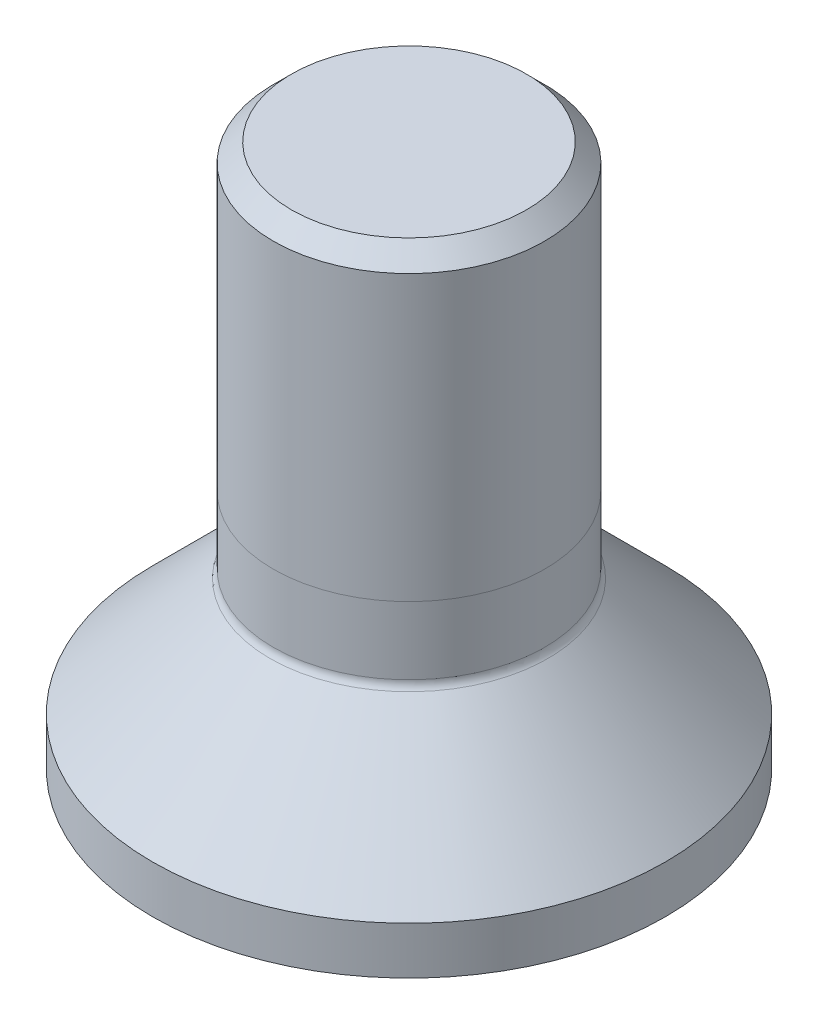
ISO-10303-21;
HEADER;
FILE_DESCRIPTION(('STEP AP214'),'2;1');
FILE_NAME('part.step','',(''),(''),'','','');
FILE_SCHEMA(('AUTOMOTIVE_DESIGN { 1 0 10303 214 1 1 1 1 }'));
ENDSEC;
DATA;
#1=APPLICATION_CONTEXT('core data for automotive mechanical design processes');
#2=APPLICATION_PROTOCOL_DEFINITION('international standard','automotive_design',2000,#1);
#3=PRODUCT_CONTEXT('',#1,'mechanical');
#4=PRODUCT('Part','Part','',(#3));
#5=PRODUCT_RELATED_PRODUCT_CATEGORY('part','',(#4));
#6=PRODUCT_DEFINITION_FORMATION('','',#4);
#7=PRODUCT_DEFINITION_CONTEXT('part definition',#1,'design');
#8=PRODUCT_DEFINITION('design','',#6,#7);
#9=PRODUCT_DEFINITION_SHAPE('','',#8);
#10=(LENGTH_UNIT() NAMED_UNIT(*) SI_UNIT(.MILLI.,.METRE.));
#11=(NAMED_UNIT(*) PLANE_ANGLE_UNIT() SI_UNIT($,.RADIAN.));
#12=(NAMED_UNIT(*) SI_UNIT($,.STERADIAN.) SOLID_ANGLE_UNIT());
#13=UNCERTAINTY_MEASURE_WITH_UNIT(LENGTH_MEASURE(1.E-05),#10,'distance_accuracy_value','');
#14=(GEOMETRIC_REPRESENTATION_CONTEXT(3) GLOBAL_UNCERTAINTY_ASSIGNED_CONTEXT((#13)) GLOBAL_UNIT_ASSIGNED_CONTEXT((#10,
#11,#12)) REPRESENTATION_CONTEXT('',''));
#15=CARTESIAN_POINT('',(0.,0.,0.));
#16=DIRECTION('',(0.,0.,1.));
#17=DIRECTION('',(1.,0.,0.));
#18=AXIS2_PLACEMENT_3D('',#15,#16,#17);
#19=CARTESIAN_POINT('',(0.,0.,0.));
#20=DIRECTION('',(0.,1.,0.));
#21=DIRECTION('',(0.,0.,1.));
#22=AXIS2_PLACEMENT_3D('',#19,#20,#21);
#23=CYLINDRICAL_SURFACE('',#22,3.);
#24=CARTESIAN_POINT('',(0.,7.88,0.));
#25=DIRECTION('',(0.,1.,0.));
#26=DIRECTION('',(0.,0.,1.));
#27=AXIS2_PLACEMENT_3D('',#24,#25,#26);
#28=CIRCLE('',#27,3.);
#29=CARTESIAN_POINT('',(0.,7.88,3.));
#30=VERTEX_POINT('',#29);
#31=EDGE_CURVE('E28',#30,#30,#28,.F.);
#32=ORIENTED_EDGE('',*,*,#31,.T.);
#33=EDGE_LOOP('',(#32));
#34=FACE_BOUND('',#33,.T.);
#35=CARTESIAN_POINT('',(0.,1.6,0.));
#36=DIRECTION('',(0.,1.,0.));
#37=DIRECTION('',(0.,0.,1.));
#38=AXIS2_PLACEMENT_3D('',#35,#36,#37);
#39=CIRCLE('',#38,3.);
#40=CARTESIAN_POINT('',(0.,1.6,3.));
#41=VERTEX_POINT('',#40);
#42=EDGE_CURVE('E11',#41,#41,#39,.T.);
#43=ORIENTED_EDGE('',*,*,#42,.T.);
#44=EDGE_LOOP('',(#43));
#45=FACE_BOUND('',#44,.T.);
#46=ADVANCED_FACE('F18',(#34,#45),#23,.T.);
#47=ORIENTED_EDGE('',*,*,#42,.F.);
#48=EDGE_LOOP('',(#47));
#49=FACE_BOUND('',#48,.T.);
#50=CARTESIAN_POINT('',(0.,0.103553390593273,0.));
#51=DIRECTION('',(0.,1.,0.));
#52=DIRECTION('',(0.,0.,1.));
#53=AXIS2_PLACEMENT_3D('',#50,#51,#52);
#54=CIRCLE('',#53,3.);
#55=CARTESIAN_POINT('',(0.,0.103553390593273,3.));
#56=VERTEX_POINT('',#55);
#57=EDGE_CURVE('E282',#56,#56,#54,.T.);
#58=ORIENTED_EDGE('',*,*,#57,.T.);
#59=EDGE_LOOP('',(#58));
#60=FACE_BOUND('',#59,.T.);
#61=ADVANCED_FACE('F195',(#49,#60),#23,.T.);
#62=CARTESIAN_POINT('',(0.,0.,0.));
#63=DIRECTION('',(0.,-1.,0.));
#64=DIRECTION('',(0.,0.,-1.));
#65=AXIS2_PLACEMENT_3D('',#62,#63,#64);
#66=CONICAL_SURFACE('',#65,3.,0.785398163397449);
#67=CARTESIAN_POINT('',(0.,-0.0732233047033635,0.));
#68=DIRECTION('',(0.,-1.,0.));
#69=DIRECTION('',(0.,0.,-1.));
#70=AXIS2_PLACEMENT_3D('',#67,#68,#69);
#71=CIRCLE('',#70,3.07322330470336);
#72=CARTESIAN_POINT('',(0.,-0.0732233047033635,-3.07322330470336));
#73=VERTEX_POINT('',#72);
#74=EDGE_CURVE('E279',#73,#73,#71,.T.);
#75=ORIENTED_EDGE('',*,*,#74,.T.);
#76=EDGE_LOOP('',(#75));
#77=FACE_BOUND('',#76,.T.);
#78=CARTESIAN_POINT('',(0.,-2.67,0.));
#79=DIRECTION('',(0.,1.,0.));
#80=DIRECTION('',(0.,0.,1.));
#81=AXIS2_PLACEMENT_3D('',#78,#79,#80);
#82=CIRCLE('',#81,5.67);
#83=CARTESIAN_POINT('',(0.,-2.67,5.67));
#84=VERTEX_POINT('',#83);
#85=EDGE_CURVE('E320',#84,#84,#82,.T.);
#86=ORIENTED_EDGE('',*,*,#85,.T.);
#87=EDGE_LOOP('',(#86));
#88=FACE_BOUND('',#87,.T.);
#89=ADVANCED_FACE('F200',(#77,#88),#66,.T.);
#90=CARTESIAN_POINT('',(0.,0.,0.));
#91=DIRECTION('',(0.,1.,0.));
#92=DIRECTION('',(0.,0.,1.));
#93=AXIS2_PLACEMENT_3D('',#90,#91,#92);
#94=CYLINDRICAL_SURFACE('',#93,5.67);
#95=CARTESIAN_POINT('',(0.,-3.72,0.));
#96=DIRECTION('',(0.,1.,0.));
#97=DIRECTION('',(0.,0.,1.));
#98=AXIS2_PLACEMENT_3D('',#95,#96,#97);
#99=CIRCLE('',#98,5.67);
#100=CARTESIAN_POINT('',(0.,-3.72,5.67));
#101=VERTEX_POINT('',#100);
#102=EDGE_CURVE('E112',#101,#101,#99,.T.);
#103=ORIENTED_EDGE('',*,*,#102,.T.);
#104=EDGE_LOOP('',(#103));
#105=FACE_BOUND('',#104,.T.);
#106=ORIENTED_EDGE('',*,*,#85,.F.);
#107=EDGE_LOOP('',(#106));
#108=FACE_BOUND('',#107,.T.);
#109=ADVANCED_FACE('F308',(#105,#108),#94,.T.);
#110=CARTESIAN_POINT('',(0.,-3.72,0.));
#111=DIRECTION('',(0.,-1.,0.));
#112=DIRECTION('',(0.,0.,-1.));
#113=AXIS2_PLACEMENT_3D('',#110,#111,#112);
#114=PLANE('',#113);
#115=CARTESIAN_POINT('',(0.,-3.72,0.));
#116=DIRECTION('',(0.,-1.,0.));
#117=DIRECTION('',(1.,0.,0.));
#118=AXIS2_PLACEMENT_3D('',#115,#116,#117);
#119=CIRCLE('',#118,2.3094010767585);
#120=CARTESIAN_POINT('',(-2.3094010767585,-3.72,0.));
#121=VERTEX_POINT('',#120);
#122=CARTESIAN_POINT('',(-1.15470053837925,-3.72,-2.));
#123=VERTEX_POINT('',#122);
#124=EDGE_CURVE('E75',#121,#123,#119,.T.);
#125=ORIENTED_EDGE('',*,*,#124,.F.);
#126=CARTESIAN_POINT('',(-1.15470053837926,-3.72,2.));
#127=VERTEX_POINT('',#126);
#128=EDGE_CURVE('E85',#127,#121,#119,.T.);
#129=ORIENTED_EDGE('',*,*,#128,.F.);
#130=CARTESIAN_POINT('',(1.15470053837924,-3.72,2.));
#131=VERTEX_POINT('',#130);
#132=EDGE_CURVE('E348',#131,#127,#119,.T.);
#133=ORIENTED_EDGE('',*,*,#132,.F.);
#134=CARTESIAN_POINT('',(2.30940107675851,-3.72,0.));
#135=VERTEX_POINT('',#134);
#136=EDGE_CURVE('E123',#135,#131,#119,.T.);
#137=ORIENTED_EDGE('',*,*,#136,.F.);
#138=CARTESIAN_POINT('',(1.15470053837925,-3.72,-2.));
#139=VERTEX_POINT('',#138);
#140=EDGE_CURVE('E119',#139,#135,#119,.T.);
#141=ORIENTED_EDGE('',*,*,#140,.F.);
#142=EDGE_CURVE('E83',#123,#139,#119,.T.);
#143=ORIENTED_EDGE('',*,*,#142,.F.);
#144=EDGE_LOOP('',(#125,#129,#133,#137,#141,#143));
#145=FACE_BOUND('',#144,.T.);
#146=ORIENTED_EDGE('',*,*,#102,.F.);
#147=EDGE_LOOP('',(#146));
#148=FACE_BOUND('',#147,.T.);
#149=ADVANCED_FACE('F116',(#145,#148),#114,.T.);
#150=CARTESIAN_POINT('',(0.,8.28,0.));
#151=DIRECTION('',(0.,1.,0.));
#152=DIRECTION('',(0.,0.,1.));
#153=AXIS2_PLACEMENT_3D('',#150,#151,#152);
#154=PLANE('',#153);
#155=CARTESIAN_POINT('',(0.,8.28,0.));
#156=DIRECTION('',(0.,1.,0.));
#157=DIRECTION('',(0.,0.,1.));
#158=AXIS2_PLACEMENT_3D('',#155,#156,#157);
#159=CIRCLE('',#158,2.6);
#160=CARTESIAN_POINT('',(0.,8.28,2.6));
#161=VERTEX_POINT('',#160);
#162=EDGE_CURVE('E288',#161,#161,#159,.T.);
#163=ORIENTED_EDGE('',*,*,#162,.T.);
#164=EDGE_LOOP('',(#163));
#165=FACE_BOUND('',#164,.T.);
#166=ADVANCED_FACE('F229',(#165),#154,.T.);
#167=CARTESIAN_POINT('',(0.,-3.101197846483,0.));
#168=DIRECTION('',(0.,-1.,0.));
#169=DIRECTION('',(1.,0.,0.));
#170=AXIS2_PLACEMENT_3D('',#167,#168,#169);
#171=CONICAL_SURFACE('',#170,0.,1.30899693899575);
#172=CARTESIAN_POINT('',(-2.30951654681234,-3.72003094242807,-0.000199999999999873));
#173=CARTESIAN_POINT('',(-2.26155517902373,-3.70717294728115,0.0828715258103722));
#174=CARTESIAN_POINT('',(-2.21350683851658,-3.69549990930549,0.166093692788131));
#175=CARTESIAN_POINT('',(-2.11724043254796,-3.67499135519067,0.33283199898783));
#176=CARTESIAN_POINT('',(-2.06902230613691,-3.66615699216785,0.416348243777555));
#177=CARTESIAN_POINT('',(-1.97270874423801,-3.65184164015699,0.583168226444383));
#178=CARTESIAN_POINT('',(-1.92461396034488,-3.64634357564339,0.666470835726325));
#179=CARTESIAN_POINT('',(-1.8283630443694,-3.63897122197136,0.833182312470903));
#180=CARTESIAN_POINT('',(-1.78020692596914,-3.63709623134524,0.916591156235452));
#181=CARTESIAN_POINT('',(-1.68389468916862,-3.63709623134524,1.08340884376455));
#182=CARTESIAN_POINT('',(-1.63573857076837,-3.63897122197136,1.1668176875291));
#183=CARTESIAN_POINT('',(-1.53948765479288,-3.64634357564339,1.33352916427368));
#184=CARTESIAN_POINT('',(-1.49139287089976,-3.65184164015699,1.41683177355562));
#185=CARTESIAN_POINT('',(-1.39507930900085,-3.66615699216786,1.58365175622245));
#186=CARTESIAN_POINT('',(-1.3468611825898,-3.67499135519067,1.66716800101217));
#187=CARTESIAN_POINT('',(-1.25059477662118,-3.69549990930549,1.83390630721187));
#188=CARTESIAN_POINT('',(-1.20254643611403,-3.70717294728115,1.91712847418963));
#189=CARTESIAN_POINT('',(-1.15458506832542,-3.72003094242807,2.0002));
#190=B_SPLINE_CURVE_WITH_KNOTS('',3,(#172,#173,#174,#175,#176,#177,#178,#179,#180,#181,#182,
#183,#184,#185,#186,#187,#188,#189),.UNSPECIFIED.,.F.,.F.,(4,2,2,2,2,2,2,2,4),(0.,
0.29035724904467,0.580832297293912,0.86980784109577,1.15872743038697,1.44764701967817,
1.73662256348003,2.02709761172927,2.31745486077394),.UNSPECIFIED.);
#191=EDGE_CURVE('E154',#121,#127,#190,.T.);
#192=ORIENTED_EDGE('',*,*,#191,.T.);
#193=ORIENTED_EDGE('',*,*,#128,.T.);
#194=EDGE_LOOP('',(#192,#193));
#195=FACE_BOUND('',#194,.T.);
#196=ADVANCED_FACE('F148',(#195),#171,.F.);
#197=CARTESIAN_POINT('',(-3.54576846416073,-4.19200034906825,2.));
#198=CARTESIAN_POINT('',(-3.46032331155691,-4.1720605783007,1.99999999999999));
#199=CARTESIAN_POINT('',(-3.37484047761441,-4.15228232054217,1.99999999999999));
#200=CARTESIAN_POINT('',(-3.20378355240315,-4.11311847013323,1.99999999999999));
#201=CARTESIAN_POINT('',(-3.11820945972395,-4.09373288364706,1.99999999999999));
#202=CARTESIAN_POINT('',(-2.86130062428642,-4.03626384835691,1.99999999999999));
#203=CARTESIAN_POINT('',(-2.68980910024909,-3.99887512354548,1.99999999999999));
#204=CARTESIAN_POINT('',(-2.34458511529227,-3.92643853365191,1.99999999999999));
#205=CARTESIAN_POINT('',(-2.1708470844132,-3.89141698135253,1.99999999999999));
#206=CARTESIAN_POINT('',(-1.82256095831907,-3.82547978469485,1.99999999999999));
#207=CARTESIAN_POINT('',(-1.64801278540452,-3.79456454295518,1.99999999999999));
#208=CARTESIAN_POINT('',(-1.30271990845847,-3.7396979088664,1.99999999999999));
#209=CARTESIAN_POINT('',(-1.13200256296387,-3.71557843402184,1.99999999999999));
#210=CARTESIAN_POINT('',(-0.78957168900048,-3.67587323584062,2.));
#211=CARTESIAN_POINT('',(-0.617858499834696,-3.66028476073478,2.));
#212=CARTESIAN_POINT('',(-0.360195403945427,-3.64525401912313,2.));
#213=CARTESIAN_POINT('',(-0.274483715684509,-3.64163460627376,2.));
#214=CARTESIAN_POINT('',(-0.102984480205778,-3.63731952917178,2.));
#215=CARTESIAN_POINT('',(-0.0171969334570614,-3.63662384696397,2.));
#216=CARTESIAN_POINT('',(0.154355873662814,-3.63819853237707,2.));
#217=CARTESIAN_POINT('',(0.240121132206933,-3.64046909420923,2.));
#218=CARTESIAN_POINT('',(0.4115263903651,-3.64785312413437,2.));
#219=CARTESIAN_POINT('',(0.497166389972951,-3.65296659236803,2.));
#220=CARTESIAN_POINT('',(0.70647885981586,-3.66865578967162,2.));
#221=CARTESIAN_POINT('',(0.830044925850676,-3.68065132303125,2.));
#222=CARTESIAN_POINT('',(1.07664653209346,-3.70907898341361,2.));
#223=CARTESIAN_POINT('',(1.1996820852021,-3.72551100192753,2.));
#224=CARTESIAN_POINT('',(1.44564714901042,-3.76186148211042,2.));
#225=CARTESIAN_POINT('',(1.5685749476794,-3.78179135163049,2.));
#226=CARTESIAN_POINT('',(1.81398159923811,-3.82425123821714,2.));
#227=CARTESIAN_POINT('',(1.93646042849966,-3.84678139015956,2.));
#228=CARTESIAN_POINT('',(2.18362417007064,-3.89428425653496,2.));
#229=CARTESIAN_POINT('',(2.30830103623405,-3.91929851142906,2.));
#230=CARTESIAN_POINT('',(2.55733999903381,-3.97084664791935,2.));
#231=CARTESIAN_POINT('',(2.68170209177124,-3.99738054824322,2.));
#232=CARTESIAN_POINT('',(2.92946437432295,-4.05143957899051,2.));
#233=CARTESIAN_POINT('',(3.05286599737637,-4.07895817166458,2.00000000000001));
#234=CARTESIAN_POINT('',(3.29945995688184,-4.13487849715075,2.));
#235=CARTESIAN_POINT('',(3.4226523077504,-4.16328016629156,2.));
#236=CARTESIAN_POINT('',(3.54576846416072,-4.19200034906827,2.));
#237=B_SPLINE_CURVE_WITH_KNOTS('',3,(#197,#198,#199,#200,#201,#202,#203,#204,#205,#206,#207,
#208,#209,#210,#211,#212,#213,#214,#215,#216,#217,#218,#219,#220,#221,#222,#223,#224,#225,#226,
#227,#228,#229,#230,#231,#232,#233,#234,#235,#236),.UNSPECIFIED.,.F.,.F.,(4,2,2,2,2,2,2,2,2,2,2,
2,2,2,2,2,2,2,2,4),(0.,0.263222401305707,0.526448931537519,1.05299375162049,1.58466125538442,
2.11638085006353,2.63348257137836,3.15041739730247,3.40773776741521,3.66505655727231,
3.92239219561216,4.17972784668617,4.55206097335712,4.92438499422329,5.29794667206535,
5.67152773515151,6.05299963584966,6.43447623871299,6.81377086422972,7.19303820510548),.UNSPECIFIED.);
#238=EDGE_CURVE('E82',#127,#131,#237,.T.);
#239=ORIENTED_EDGE('',*,*,#238,.T.);
#240=ORIENTED_EDGE('',*,*,#132,.T.);
#241=EDGE_LOOP('',(#239,#240));
#242=FACE_BOUND('',#241,.T.);
#243=ADVANCED_FACE('F306',(#242),#171,.F.);
#244=CARTESIAN_POINT('',(1.15458506832541,-3.72003094242808,2.0002));
#245=CARTESIAN_POINT('',(1.20254643611402,-3.70717294728116,1.91712847418963));
#246=CARTESIAN_POINT('',(1.25059477662117,-3.69549990930549,1.83390630721187));
#247=CARTESIAN_POINT('',(1.34686118258979,-3.67499135519067,1.66716800101217));
#248=CARTESIAN_POINT('',(1.39507930900085,-3.66615699216786,1.58365175622245));
#249=CARTESIAN_POINT('',(1.49139287089975,-3.651841640157,1.41683177355562));
#250=CARTESIAN_POINT('',(1.53948765479288,-3.64634357564339,1.33352916427368));
#251=CARTESIAN_POINT('',(1.63573857076836,-3.63897122197136,1.1668176875291));
#252=CARTESIAN_POINT('',(1.68389468916862,-3.63709623134525,1.08340884376455));
#253=CARTESIAN_POINT('',(1.78020692596913,-3.63709623134525,0.916591156235453));
#254=CARTESIAN_POINT('',(1.82836304436939,-3.63897122197136,0.833182312470904));
#255=CARTESIAN_POINT('',(1.92461396034487,-3.64634357564339,0.666470835726327));
#256=CARTESIAN_POINT('',(1.972708744238,-3.651841640157,0.583168226444384));
#257=CARTESIAN_POINT('',(2.0690223061369,-3.66615699216786,0.416348243777556));
#258=CARTESIAN_POINT('',(2.11724043254796,-3.67499135519067,0.332831998987831));
#259=CARTESIAN_POINT('',(2.21350683851658,-3.69549990930549,0.166093692788132));
#260=CARTESIAN_POINT('',(2.26155517902373,-3.70717294728116,0.0828715258103744));
#261=CARTESIAN_POINT('',(2.30951654681234,-3.72003094242808,-0.000199999999996525));
#262=B_SPLINE_CURVE_WITH_KNOTS('',3,(#244,#245,#246,#247,#248,#249,#250,#251,#252,#253,#254,
#255,#256,#257,#258,#259,#260,#261),.UNSPECIFIED.,.F.,.F.,(4,2,2,2,2,2,2,2,4),(0.,
0.290357249044671,0.580832297293914,0.869807841095771,1.15872743038697,1.44764701967818,
1.73662256348003,2.02709761172928,2.31745486077395),.UNSPECIFIED.);
#263=EDGE_CURVE('E134',#131,#135,#262,.T.);
#264=ORIENTED_EDGE('',*,*,#263,.T.);
#265=ORIENTED_EDGE('',*,*,#136,.T.);
#266=EDGE_LOOP('',(#264,#265));
#267=FACE_BOUND('',#266,.T.);
#268=ADVANCED_FACE('F354',(#267),#171,.F.);
#269=CARTESIAN_POINT('',(2.30951654681234,-3.72003094242808,0.000200000000003789));
#270=CARTESIAN_POINT('',(2.26155517902373,-3.70717294728116,-0.0828715258103691));
#271=CARTESIAN_POINT('',(2.21350683851658,-3.69549990930549,-0.166093692788128));
#272=CARTESIAN_POINT('',(2.11724043254796,-3.67499135519067,-0.332831998987827));
#273=CARTESIAN_POINT('',(2.06902230613691,-3.66615699216786,-0.416348243777553));
#274=CARTESIAN_POINT('',(1.97270874423801,-3.651841640157,-0.58316822644438));
#275=CARTESIAN_POINT('',(1.92461396034488,-3.64634357564339,-0.666470835726323));
#276=CARTESIAN_POINT('',(1.8283630443694,-3.63897122197136,-0.833182312470901));
#277=CARTESIAN_POINT('',(1.78020692596914,-3.63709623134525,-0.91659115623545));
#278=CARTESIAN_POINT('',(1.68389468916862,-3.63709623134525,-1.08340884376455));
#279=CARTESIAN_POINT('',(1.63573857076836,-3.63897122197136,-1.1668176875291));
#280=CARTESIAN_POINT('',(1.53948765479288,-3.64634357564339,-1.33352916427368));
#281=CARTESIAN_POINT('',(1.49139287089975,-3.651841640157,-1.41683177355562));
#282=CARTESIAN_POINT('',(1.39507930900085,-3.66615699216786,-1.58365175622245));
#283=CARTESIAN_POINT('',(1.3468611825898,-3.67499135519067,-1.66716800101217));
#284=CARTESIAN_POINT('',(1.25059477662118,-3.69549990930549,-1.83390630721187));
#285=CARTESIAN_POINT('',(1.20254643611403,-3.70717294728116,-1.91712847418963));
#286=CARTESIAN_POINT('',(1.15458506832542,-3.72003094242808,-2.0002));
#287=B_SPLINE_CURVE_WITH_KNOTS('',3,(#269,#270,#271,#272,#273,#274,#275,#276,#277,#278,#279,
#280,#281,#282,#283,#284,#285,#286),.UNSPECIFIED.,.F.,.F.,(4,2,2,2,2,2,2,2,4),(0.,
0.290357249044671,0.580832297293914,0.869807841095771,1.15872743038697,1.44764701967818,
1.73662256348003,2.02709761172928,2.31745486077395),.UNSPECIFIED.);
#288=EDGE_CURVE('E96',#135,#139,#287,.T.);
#289=ORIENTED_EDGE('',*,*,#288,.T.);
#290=ORIENTED_EDGE('',*,*,#140,.T.);
#291=EDGE_LOOP('',(#289,#290));
#292=FACE_BOUND('',#291,.T.);
#293=ADVANCED_FACE('F352',(#292),#171,.F.);
#294=CARTESIAN_POINT('',(3.54576846416073,-4.19200034906827,-2.));
#295=CARTESIAN_POINT('',(3.46032331155691,-4.17206057830072,-1.99999999999999));
#296=CARTESIAN_POINT('',(3.37484047761441,-4.15228232054219,-1.99999999999999));
#297=CARTESIAN_POINT('',(3.20378355240315,-4.11311847013324,-1.99999999999999));
#298=CARTESIAN_POINT('',(3.11820945972395,-4.09373288364707,-1.99999999999999));
#299=CARTESIAN_POINT('',(2.86130062428642,-4.03626384835692,-1.99999999999999));
#300=CARTESIAN_POINT('',(2.68980910024909,-3.99887512354549,-1.99999999999999));
#301=CARTESIAN_POINT('',(2.34458511529228,-3.92643853365192,-1.99999999999999));
#302=CARTESIAN_POINT('',(2.1708470844132,-3.89141698135254,-1.99999999999999));
#303=CARTESIAN_POINT('',(1.82256095831907,-3.82547978469486,-1.99999999999999));
#304=CARTESIAN_POINT('',(1.64801278540453,-3.79456454295519,-1.99999999999999));
#305=CARTESIAN_POINT('',(1.30271990845848,-3.73969790886641,-1.99999999999999));
#306=CARTESIAN_POINT('',(1.13200256296387,-3.71557843402185,-2.));
#307=CARTESIAN_POINT('',(0.789571689000483,-3.67587323584062,-2.));
#308=CARTESIAN_POINT('',(0.6178584998347,-3.66028476073478,-2.));
#309=CARTESIAN_POINT('',(0.360195403945431,-3.64525401912313,-2.));
#310=CARTESIAN_POINT('',(0.274483715684513,-3.64163460627377,-2.));
#311=CARTESIAN_POINT('',(0.102984480205782,-3.63731952917178,-2.));
#312=CARTESIAN_POINT('',(0.0171969334570651,-3.63662384696397,-2.));
#313=CARTESIAN_POINT('',(-0.15435587366281,-3.63819853237707,-2.));
#314=CARTESIAN_POINT('',(-0.240121132206929,-3.64046909420923,-2.));
#315=CARTESIAN_POINT('',(-0.411526390365097,-3.64785312413437,-2.));
#316=CARTESIAN_POINT('',(-0.497166389972947,-3.65296659236802,-2.));
#317=CARTESIAN_POINT('',(-0.706478859815856,-3.66865578967162,-2.));
#318=CARTESIAN_POINT('',(-0.830044925850673,-3.68065132303124,-2.));
#319=CARTESIAN_POINT('',(-1.07664653209346,-3.70907898341361,-2.));
#320=CARTESIAN_POINT('',(-1.19968208520209,-3.72551100192753,-2.));
#321=CARTESIAN_POINT('',(-1.44564714901042,-3.76186148211041,-2.));
#322=CARTESIAN_POINT('',(-1.5685749476794,-3.78179135163048,-2.));
#323=CARTESIAN_POINT('',(-1.81398159923811,-3.82425123821713,-2.));
#324=CARTESIAN_POINT('',(-1.93646042849967,-3.84678139015956,-2.));
#325=CARTESIAN_POINT('',(-2.18362417007064,-3.89428425653496,-2.));
#326=CARTESIAN_POINT('',(-2.30830103623406,-3.91929851142906,-2.));
#327=CARTESIAN_POINT('',(-2.55733999903382,-3.97084664791934,-2.));
#328=CARTESIAN_POINT('',(-2.68170209177125,-3.99738054824321,-2.));
#329=CARTESIAN_POINT('',(-2.92946437432296,-4.0514395789905,-2.));
#330=CARTESIAN_POINT('',(-3.05286599737638,-4.07895817166457,-2.));
#331=CARTESIAN_POINT('',(-3.29945995688185,-4.13487849715074,-2.));
#332=CARTESIAN_POINT('',(-3.4226523077504,-4.16328016629155,-2.));
#333=CARTESIAN_POINT('',(-3.54576846416072,-4.19200034906825,-2.));
#334=B_SPLINE_CURVE_WITH_KNOTS('',3,(#294,#295,#296,#297,#298,#299,#300,#301,#302,#303,#304,
#305,#306,#307,#308,#309,#310,#311,#312,#313,#314,#315,#316,#317,#318,#319,#320,#321,#322,#323,
#324,#325,#326,#327,#328,#329,#330,#331,#332,#333),.UNSPECIFIED.,.F.,.F.,(4,2,2,2,2,2,2,2,2,2,2,
2,2,2,2,2,2,2,2,4),(0.,0.263222401305708,0.526448931537519,1.05299375162049,1.58466125538442,
2.11638085006353,2.63348257137836,3.15041739730246,3.40773776741521,3.66505655727231,
3.92239219561216,4.17972784668616,4.55206097335711,4.92438499422329,5.29794667206535,
5.67152773515151,6.05299963584967,6.434476238713,6.81377086422972,7.19303820510549),.UNSPECIFIED.);
#335=EDGE_CURVE('E88',#139,#123,#334,.T.);
#336=ORIENTED_EDGE('',*,*,#335,.T.);
#337=ORIENTED_EDGE('',*,*,#142,.T.);
#338=EDGE_LOOP('',(#336,#337));
#339=FACE_BOUND('',#338,.T.);
#340=ADVANCED_FACE('F89',(#339),#171,.F.);
#341=CARTESIAN_POINT('',(-1.15458506832541,-3.72003094242807,-2.0002));
#342=CARTESIAN_POINT('',(-1.20254643611402,-3.70717294728115,-1.91712847418963));
#343=CARTESIAN_POINT('',(-1.25059477662117,-3.69549990930549,-1.83390630721187));
#344=CARTESIAN_POINT('',(-1.34686118258979,-3.67499135519067,-1.66716800101217));
#345=CARTESIAN_POINT('',(-1.39507930900085,-3.66615699216785,-1.58365175622245));
#346=CARTESIAN_POINT('',(-1.49139287089975,-3.65184164015699,-1.41683177355562));
#347=CARTESIAN_POINT('',(-1.53948765479288,-3.64634357564338,-1.33352916427368));
#348=CARTESIAN_POINT('',(-1.63573857076836,-3.63897122197136,-1.1668176875291));
#349=CARTESIAN_POINT('',(-1.68389468916862,-3.63709623134524,-1.08340884376455));
#350=CARTESIAN_POINT('',(-1.78020692596913,-3.63709623134524,-0.91659115623545));
#351=CARTESIAN_POINT('',(-1.82836304436939,-3.63897122197136,-0.833182312470901));
#352=CARTESIAN_POINT('',(-1.92461396034487,-3.64634357564338,-0.666470835726323));
#353=CARTESIAN_POINT('',(-1.972708744238,-3.65184164015699,-0.583168226444381));
#354=CARTESIAN_POINT('',(-2.0690223061369,-3.66615699216785,-0.416348243777553));
#355=CARTESIAN_POINT('',(-2.11724043254796,-3.67499135519066,-0.332831998987827));
#356=CARTESIAN_POINT('',(-2.21350683851658,-3.69549990930548,-0.166093692788128));
#357=CARTESIAN_POINT('',(-2.26155517902373,-3.70717294728115,-0.0828715258103704));
#358=CARTESIAN_POINT('',(-2.30951654681234,-3.72003094242807,0.000200000000000341));
#359=B_SPLINE_CURVE_WITH_KNOTS('',3,(#341,#342,#343,#344,#345,#346,#347,#348,#349,#350,#351,
#352,#353,#354,#355,#356,#357,#358),.UNSPECIFIED.,.F.,.F.,(4,2,2,2,2,2,2,2,4),(0.,
0.290357249044671,0.580832297293914,0.869807841095772,1.15872743038697,1.44764701967818,
1.73662256348004,2.02709761172928,2.31745486077395),.UNSPECIFIED.);
#360=EDGE_CURVE('E34',#123,#121,#359,.T.);
#361=ORIENTED_EDGE('',*,*,#360,.T.);
#362=ORIENTED_EDGE('',*,*,#124,.T.);
#363=EDGE_LOOP('',(#361,#362));
#364=FACE_BOUND('',#363,.T.);
#365=ADVANCED_FACE('F77',(#364),#171,.F.);
#366=CARTESIAN_POINT('',(0.,0.0916732764428422,0.));
#367=DIRECTION('',(0.,-1.,0.));
#368=DIRECTION('',(0.,0.,-1.));
#369=AXIS2_PLACEMENT_3D('',#366,#367,#368);
#370=CONICAL_SURFACE('',#369,0.,1.0471975511966);
#371=CARTESIAN_POINT('',(0.,0.0916732764428422,0.));
#372=VERTEX_POINT('',#371);
#373=VERTEX_LOOP('',#372);
#374=FACE_BOUND('',#373,.T.);
#375=CARTESIAN_POINT('',(-1.15458506832542,-1.24172672855691,2.0002));
#376=CARTESIAN_POINT('',(-1.20532911262018,-1.21241679803709,1.91230873709994));
#377=CARTESIAN_POINT('',(-1.2565111744778,-1.18576011391688,1.82365880552641));
#378=CARTESIAN_POINT('',(-1.3597616401932,-1.13922975295713,1.6448237530022));
#379=CARTESIAN_POINT('',(-1.41183187919145,-1.11937253831919,1.55463545349496));
#380=CARTESIAN_POINT('',(-1.51532701829184,-1.08846072595966,1.37537661423669));
#381=CARTESIAN_POINT('',(-1.56673599086579,-1.07720041353494,1.28633366177369));
#382=CARTESIAN_POINT('',(-1.66979593505374,-1.06375592453105,1.10782860221495));
#383=CARTESIAN_POINT('',(-1.72144653186531,-1.06156061688988,1.01836714429604));
#384=CARTESIAN_POINT('',(-1.81796535054794,-1.06611825126706,0.851191646451197));
#385=CARTESIAN_POINT('',(-1.86284799277603,-1.07175213662343,0.773452629734213));
#386=CARTESIAN_POINT('',(-1.95232085557725,-1.08961115719724,0.618481085463865));
#387=CARTESIAN_POINT('',(-1.99691076648955,-1.10184239795985,0.5412490942588));
#388=CARTESIAN_POINT('',(-2.08656822922817,-1.13242069880402,0.385957813517798));
#389=CARTESIAN_POINT('',(-2.13162442866767,-1.15089742900213,0.30791818689262));
#390=CARTESIAN_POINT('',(-2.221064675979,-1.19283278014927,0.153003134307866));
#391=CARTESIAN_POINT('',(-2.26544987045196,-1.21628154242873,0.0761257223768806));
#392=CARTESIAN_POINT('',(-2.30951654681234,-1.24172672855691,-0.000200000000000067));
#393=B_SPLINE_CURVE_WITH_KNOTS('',3,(#375,#376,#377,#378,#379,#380,#381,#382,#383,#384,#385,
#386,#387,#388,#389,#390,#391,#392),.UNSPECIFIED.,.F.,.F.,(4,2,2,2,2,2,2,2,4),(0.,
0.317031824695611,0.634825876346566,0.944753967652639,1.25430138000372,1.52387047293094,
1.79368946861028,2.06949491027634,2.34475850821472),.UNSPECIFIED.);
#394=CARTESIAN_POINT('',(-1.15470053837926,-1.2416600568905,2.));
#395=VERTEX_POINT('',#394);
#396=CARTESIAN_POINT('',(-2.3094010767585,-1.24166005689049,0.));
#397=VERTEX_POINT('',#396);
#398=EDGE_CURVE('E234',#395,#397,#393,.T.);
#399=ORIENTED_EDGE('',*,*,#398,.T.);
#400=CARTESIAN_POINT('',(-2.30951654681234,-1.24172672855691,0.000200000000000068));
#401=CARTESIAN_POINT('',(-2.25877250251757,-1.21241679803709,-0.0876912629000587));
#402=CARTESIAN_POINT('',(-2.20759044065995,-1.18576011391688,-0.17634119447359));
#403=CARTESIAN_POINT('',(-2.10433997494456,-1.13922975295713,-0.3551762469978));
#404=CARTESIAN_POINT('',(-2.0522697359463,-1.11937253831919,-0.445364546505035));
#405=CARTESIAN_POINT('',(-1.94877459684592,-1.08846072595966,-0.624623385763304));
#406=CARTESIAN_POINT('',(-1.89736562427197,-1.07720041353494,-0.713666338226302));
#407=CARTESIAN_POINT('',(-1.79430568008402,-1.06375592453105,-0.892171397785041));
#408=CARTESIAN_POINT('',(-1.74265508327244,-1.06156061688988,-0.981632855703956));
#409=CARTESIAN_POINT('',(-1.64613626458981,-1.06611825126706,-1.1488083535488));
#410=CARTESIAN_POINT('',(-1.60125362236172,-1.07175213662342,-1.22654737026578));
#411=CARTESIAN_POINT('',(-1.5117807595605,-1.08961115719724,-1.38151891453613));
#412=CARTESIAN_POINT('',(-1.46719084864821,-1.10184239795985,-1.4587509057412));
#413=CARTESIAN_POINT('',(-1.37753338590959,-1.13242069880402,-1.6140421864822));
#414=CARTESIAN_POINT('',(-1.33247718647008,-1.15089742900212,-1.69208181310738));
#415=CARTESIAN_POINT('',(-1.24303693915875,-1.19283278014927,-1.84699686569213));
#416=CARTESIAN_POINT('',(-1.19865174468579,-1.21628154242872,-1.92387427762312));
#417=CARTESIAN_POINT('',(-1.15458506832541,-1.24172672855691,-2.0002));
#418=B_SPLINE_CURVE_WITH_KNOTS('',3,(#400,#401,#402,#403,#404,#405,#406,#407,#408,#409,#410,
#411,#412,#413,#414,#415,#416,#417),.UNSPECIFIED.,.F.,.F.,(4,2,2,2,2,2,2,2,4),(0.,
0.317031824695611,0.634825876346564,0.944753967652636,1.25430138000371,1.52387047293094,
1.79368946861028,2.06949491027634,2.34475850821473),.UNSPECIFIED.);
#419=CARTESIAN_POINT('',(-1.15470053837925,-1.24166005689049,-2.));
#420=VERTEX_POINT('',#419);
#421=EDGE_CURVE('E211',#397,#420,#418,.T.);
#422=ORIENTED_EDGE('',*,*,#421,.T.);
#423=CARTESIAN_POINT('',(-3.97107242292986,-2.47538835040826,-2.));
#424=CARTESIAN_POINT('',(-3.87868247277526,-2.42775059746127,-2.));
#425=CARTESIAN_POINT('',(-3.7861588003778,-2.38037372958414,-2.));
#426=CARTESIAN_POINT('',(-3.60078450821548,-2.28626017948103,-2.00000000000001));
#427=CARTESIAN_POINT('',(-3.50793388259158,-2.23952350880157,-2.00000000000001));
#428=CARTESIAN_POINT('',(-3.22850900761148,-2.10030535880982,-2.));
#429=CARTESIAN_POINT('',(-3.04135761037277,-2.00896924768975,-2.));
#430=CARTESIAN_POINT('',(-2.75397555619272,-1.8731154540905,-2.));
#431=CARTESIAN_POINT('',(-2.65454530475032,-1.82690595800733,-2.));
#432=CARTESIAN_POINT('',(-2.45492785759602,-1.73615536855376,-2.));
#433=CARTESIAN_POINT('',(-2.3547406899451,-1.69161421369455,-2.));
#434=CARTESIAN_POINT('',(-2.15350213975009,-1.60470652650298,-2.));
#435=CARTESIAN_POINT('',(-2.05245137959688,-1.56233856057289,-2.));
#436=CARTESIAN_POINT('',(-1.84919030086332,-1.48039650371769,-2.));
#437=CARTESIAN_POINT('',(-1.74697972173689,-1.44082305558609,-2.));
#438=CARTESIAN_POINT('',(-1.52508206994959,-1.35946514421621,-2.));
#439=CARTESIAN_POINT('',(-1.40516322629618,-1.31830385306277,-2.));
#440=CARTESIAN_POINT('',(-1.16321218809007,-1.24283207445455,-2.));
#441=CARTESIAN_POINT('',(-1.04118108489843,-1.20851815754093,-2.));
#442=CARTESIAN_POINT('',(-0.797191699347655,-1.14976263239541,-2.));
#443=CARTESIAN_POINT('',(-0.675277439673617,-1.12514332041059,-2.));
#444=CARTESIAN_POINT('',(-0.42968597996561,-1.08740551194056,-2.));
#445=CARTESIAN_POINT('',(-0.306009864773069,-1.07428022489886,-2.));
#446=CARTESIAN_POINT('',(-0.0561948130021473,-1.06122281822079,-2.));
#447=CARTESIAN_POINT('',(0.0699543957642671,-1.06147752337208,-2.));
#448=CARTESIAN_POINT('',(0.321490472578919,-1.07560900513167,-2.));
#449=CARTESIAN_POINT('',(0.446877078128915,-1.08949023167683,-2.));
#450=CARTESIAN_POINT('',(0.698268076239721,-1.12933925104034,-2.));
#451=CARTESIAN_POINT('',(0.824232704616094,-1.15554830919225,-1.99999999999999));
#452=CARTESIAN_POINT('',(1.07382197335698,-1.21731401923626,-2.));
#453=CARTESIAN_POINT('',(1.19744582529425,-1.25287376265845,-2.));
#454=CARTESIAN_POINT('',(1.43877717975325,-1.32962266424125,-2.));
#455=CARTESIAN_POINT('',(1.55655051066925,-1.37060890554915,-2.));
#456=CARTESIAN_POINT('',(1.79038315988529,-1.45724391469459,-1.99999999999999));
#457=CARTESIAN_POINT('',(1.90644203337209,-1.50289386902531,-1.99999999999999));
#458=CARTESIAN_POINT('',(2.13727613898438,-1.59764227315017,-1.99999999999999));
#459=CARTESIAN_POINT('',(2.25204987258198,-1.6467443434052,-1.99999999999999));
#460=CARTESIAN_POINT('',(2.48048565996256,-1.74747310577301,-1.99999999999999));
#461=CARTESIAN_POINT('',(2.59414765093807,-1.799099939544,-1.99999999999999));
#462=CARTESIAN_POINT('',(2.81406706680889,-1.90122748447267,-1.99999999999999));
#463=CARTESIAN_POINT('',(2.92037405177845,-1.95162191070667,-1.99999999999999));
#464=CARTESIAN_POINT('',(3.1323563665145,-2.05372845058398,-1.99999999999999));
#465=CARTESIAN_POINT('',(3.23803167473215,-2.10544060886685,-1.99999999999999));
#466=CARTESIAN_POINT('',(3.44851064882037,-2.20972549113419,-1.99999999999999));
#467=CARTESIAN_POINT('',(3.55331605390046,-2.26229471304186,-1.99999999999999));
#468=CARTESIAN_POINT('',(3.7624942913087,-2.36826501338616,-1.99999999999999));
#469=CARTESIAN_POINT('',(3.86686716058578,-2.42166601883339,-1.99999999999999));
#470=CARTESIAN_POINT('',(3.97107242292986,-2.47538835040826,-2.));
#471=B_SPLINE_CURVE_WITH_KNOTS('',3,(#423,#424,#425,#426,#427,#428,#429,#430,#431,#432,#433,
#434,#435,#436,#437,#438,#439,#440,#441,#442,#443,#444,#445,#446,#447,#448,#449,#450,#451,#452,
#453,#454,#455,#456,#457,#458,#459,#460,#461,#462,#463,#464,#465,#466,#467,#468,#469,#470),
.UNSPECIFIED.,.F.,.F.,(4,2,2,2,2,2,2,2,2,2,2,2,2,2,2,2,2,2,2,2,2,2,2,4),(0.,0.311842723826934,
0.62369106463389,1.24838758455579,1.57730682351192,1.90621392778465,2.23490119378744,
2.56366381964157,2.94387628317646,3.32389783939494,3.69658721194995,4.06905625447051,
4.44672744508521,4.82452201071132,5.21003920255201,5.59568401496473,5.96965872681082,
6.34372881945369,6.71819725104189,7.09268671728378,7.44561614609446,7.79855754669429,
8.15030525169475,8.50202226264184),.UNSPECIFIED.);
#472=CARTESIAN_POINT('',(1.15470053837925,-1.2416600568905,-2.));
#473=VERTEX_POINT('',#472);
#474=EDGE_CURVE('E109',#420,#473,#471,.T.);
#475=ORIENTED_EDGE('',*,*,#474,.T.);
#476=CARTESIAN_POINT('',(1.15458506832542,-1.24172672855691,-2.0002));
#477=CARTESIAN_POINT('',(1.20532911262018,-1.21241679803709,-1.91230873709994));
#478=CARTESIAN_POINT('',(1.2565111744778,-1.18576011391688,-1.82365880552641));
#479=CARTESIAN_POINT('',(1.3597616401932,-1.13922975295713,-1.6448237530022));
#480=CARTESIAN_POINT('',(1.41183187919145,-1.11937253831919,-1.55463545349496));
#481=CARTESIAN_POINT('',(1.51532701829184,-1.08846072595966,-1.37537661423669));
#482=CARTESIAN_POINT('',(1.56673599086579,-1.07720041353494,-1.2863336617737));
#483=CARTESIAN_POINT('',(1.66979593505373,-1.06375592453105,-1.10782860221496));
#484=CARTESIAN_POINT('',(1.72144653186531,-1.06156061688988,-1.01836714429604));
#485=CARTESIAN_POINT('',(1.81796535054794,-1.06611825126706,-0.851191646451198));
#486=CARTESIAN_POINT('',(1.86284799277603,-1.07175213662343,-0.773452629734215));
#487=CARTESIAN_POINT('',(1.95232085557725,-1.08961115719724,-0.618481085463866));
#488=CARTESIAN_POINT('',(1.99691076648955,-1.10184239795985,-0.541249094258801));
#489=CARTESIAN_POINT('',(2.08656822922816,-1.13242069880402,-0.385957813517798));
#490=CARTESIAN_POINT('',(2.13162442866767,-1.15089742900213,-0.307918186892619));
#491=CARTESIAN_POINT('',(2.221064675979,-1.19283278014927,-0.153003134307864));
#492=CARTESIAN_POINT('',(2.26544987045196,-1.21628154242873,-0.0761257223768779));
#493=CARTESIAN_POINT('',(2.30951654681234,-1.24172672855691,0.000200000000004033));
#494=B_SPLINE_CURVE_WITH_KNOTS('',3,(#476,#477,#478,#479,#480,#481,#482,#483,#484,#485,#486,
#487,#488,#489,#490,#491,#492,#493),.UNSPECIFIED.,.F.,.F.,(4,2,2,2,2,2,2,2,4),(0.,
0.317031824695611,0.634825876346565,0.944753967652637,1.25430138000371,1.52387047293094,
1.79368946861028,2.06949491027634,2.34475850821473),.UNSPECIFIED.);
#495=CARTESIAN_POINT('',(2.3094010767585,-1.2416600568905,0.));
#496=VERTEX_POINT('',#495);
#497=EDGE_CURVE('E258',#473,#496,#494,.T.);
#498=ORIENTED_EDGE('',*,*,#497,.T.);
#499=CARTESIAN_POINT('',(2.30951654681234,-1.24172672855691,-0.000199999999996057));
#500=CARTESIAN_POINT('',(2.25877250251757,-1.21241679803709,0.0876912629000633));
#501=CARTESIAN_POINT('',(2.20759044065995,-1.18576011391688,0.176341194473594));
#502=CARTESIAN_POINT('',(2.10433997494456,-1.13922975295713,0.355176246997805));
#503=CARTESIAN_POINT('',(2.0522697359463,-1.11937253831919,0.445364546505039));
#504=CARTESIAN_POINT('',(1.94877459684592,-1.08846072595966,0.624623385763309));
#505=CARTESIAN_POINT('',(1.89736562427197,-1.07720041353494,0.713666338226308));
#506=CARTESIAN_POINT('',(1.79430568008402,-1.06375592453105,0.892171397785046));
#507=CARTESIAN_POINT('',(1.74265508327243,-1.06156061688988,0.98163285570396));
#508=CARTESIAN_POINT('',(1.64613626458981,-1.06611825126706,1.1488083535488));
#509=CARTESIAN_POINT('',(1.60125362236172,-1.07175213662342,1.22654737026579));
#510=CARTESIAN_POINT('',(1.5117807595605,-1.08961115719724,1.38151891453614));
#511=CARTESIAN_POINT('',(1.46719084864821,-1.10184239795985,1.4587509057412));
#512=CARTESIAN_POINT('',(1.37753338590959,-1.13242069880402,1.6140421864822));
#513=CARTESIAN_POINT('',(1.33247718647008,-1.15089742900213,1.69208181310738));
#514=CARTESIAN_POINT('',(1.24303693915875,-1.19283278014927,1.84699686569214));
#515=CARTESIAN_POINT('',(1.19865174468579,-1.21628154242872,1.92387427762312));
#516=CARTESIAN_POINT('',(1.15458506832541,-1.24172672855691,2.0002));
#517=B_SPLINE_CURVE_WITH_KNOTS('',3,(#499,#500,#501,#502,#503,#504,#505,#506,#507,#508,#509,
#510,#511,#512,#513,#514,#515,#516),.UNSPECIFIED.,.F.,.F.,(4,2,2,2,2,2,2,2,4),(0.,
0.317031824695611,0.634825876346565,0.944753967652638,1.25430138000371,1.52387047293094,
1.79368946861028,2.06949491027634,2.34475850821473),.UNSPECIFIED.);
#518=CARTESIAN_POINT('',(1.15470053837924,-1.24166005689049,2.));
#519=VERTEX_POINT('',#518);
#520=EDGE_CURVE('E252',#496,#519,#517,.T.);
#521=ORIENTED_EDGE('',*,*,#520,.T.);
#522=CARTESIAN_POINT('',(3.97107242292986,-2.47538835040825,2.));
#523=CARTESIAN_POINT('',(3.87868247277525,-2.42775059746126,2.));
#524=CARTESIAN_POINT('',(3.7861588003778,-2.38037372958414,2.00000000000001));
#525=CARTESIAN_POINT('',(3.60078450821547,-2.28626017948102,2.00000000000001));
#526=CARTESIAN_POINT('',(3.50793388259158,-2.23952350880157,2.00000000000001));
#527=CARTESIAN_POINT('',(3.22850900761148,-2.10030535880982,2.));
#528=CARTESIAN_POINT('',(3.04135761037276,-2.00896924768975,2.));
#529=CARTESIAN_POINT('',(2.75397555619272,-1.8731154540905,2.));
#530=CARTESIAN_POINT('',(2.65454530475031,-1.82690595800733,2.));
#531=CARTESIAN_POINT('',(2.45492785759602,-1.73615536855376,2.));
#532=CARTESIAN_POINT('',(2.35474068994509,-1.69161421369454,2.));
#533=CARTESIAN_POINT('',(2.15350213975008,-1.60470652650297,2.));
#534=CARTESIAN_POINT('',(2.05245137959687,-1.56233856057289,2.));
#535=CARTESIAN_POINT('',(1.84919030086332,-1.48039650371768,2.));
#536=CARTESIAN_POINT('',(1.74697972173688,-1.44082305558609,2.));
#537=CARTESIAN_POINT('',(1.52508206994959,-1.35946514421621,2.));
#538=CARTESIAN_POINT('',(1.40516322629617,-1.31830385306277,2.));
#539=CARTESIAN_POINT('',(1.16321218809006,-1.24283207445455,2.));
#540=CARTESIAN_POINT('',(1.04118108489843,-1.20851815754093,2.));
#541=CARTESIAN_POINT('',(0.797191699347647,-1.14976263239541,2.));
#542=CARTESIAN_POINT('',(0.675277439673609,-1.12514332041058,2.));
#543=CARTESIAN_POINT('',(0.429685979965601,-1.08740551194056,2.));
#544=CARTESIAN_POINT('',(0.30600986477306,-1.07428022489886,2.));
#545=CARTESIAN_POINT('',(0.0561948130021376,-1.06122281822079,2.));
#546=CARTESIAN_POINT('',(-0.0699543957642771,-1.06147752337208,2.));
#547=CARTESIAN_POINT('',(-0.32149047257893,-1.07560900513167,2.));
#548=CARTESIAN_POINT('',(-0.446877078128926,-1.08949023167683,2.));
#549=CARTESIAN_POINT('',(-0.698268076239732,-1.12933925104034,2.));
#550=CARTESIAN_POINT('',(-0.824232704616105,-1.15554830919225,1.99999999999999));
#551=CARTESIAN_POINT('',(-1.07382197335699,-1.21731401923626,2.));
#552=CARTESIAN_POINT('',(-1.19744582529427,-1.25287376265845,2.));
#553=CARTESIAN_POINT('',(-1.43877717975326,-1.32962266424125,2.));
#554=CARTESIAN_POINT('',(-1.55655051066926,-1.37060890554915,1.99999999999999));
#555=CARTESIAN_POINT('',(-1.79038315988529,-1.45724391469459,1.99999999999999));
#556=CARTESIAN_POINT('',(-1.90644203337209,-1.50289386902531,1.99999999999999));
#557=CARTESIAN_POINT('',(-2.13727613898438,-1.59764227315017,1.99999999999999));
#558=CARTESIAN_POINT('',(-2.25204987258198,-1.6467443434052,1.99999999999999));
#559=CARTESIAN_POINT('',(-2.48048565996256,-1.74747310577301,1.99999999999999));
#560=CARTESIAN_POINT('',(-2.59414765093807,-1.799099939544,1.99999999999999));
#561=CARTESIAN_POINT('',(-2.81406706680889,-1.90122748447267,1.99999999999999));
#562=CARTESIAN_POINT('',(-2.92037405177846,-1.95162191070667,1.99999999999999));
#563=CARTESIAN_POINT('',(-3.1323563665145,-2.05372845058398,1.99999999999999));
#564=CARTESIAN_POINT('',(-3.23803167473215,-2.10544060886685,1.99999999999999));
#565=CARTESIAN_POINT('',(-3.44851064882038,-2.20972549113419,1.99999999999999));
#566=CARTESIAN_POINT('',(-3.55331605390046,-2.26229471304186,1.99999999999999));
#567=CARTESIAN_POINT('',(-3.7624942913087,-2.36826501338616,1.99999999999999));
#568=CARTESIAN_POINT('',(-3.86686716058578,-2.42166601883339,1.99999999999999));
#569=CARTESIAN_POINT('',(-3.97107242292986,-2.47538835040825,2.));
#570=B_SPLINE_CURVE_WITH_KNOTS('',3,(#522,#523,#524,#525,#526,#527,#528,#529,#530,#531,#532,
#533,#534,#535,#536,#537,#538,#539,#540,#541,#542,#543,#544,#545,#546,#547,#548,#549,#550,#551,
#552,#553,#554,#555,#556,#557,#558,#559,#560,#561,#562,#563,#564,#565,#566,#567,#568,#569),
.UNSPECIFIED.,.F.,.F.,(4,2,2,2,2,2,2,2,2,2,2,2,2,2,2,2,2,2,2,2,2,2,2,4),(0.,0.311842723826934,
0.62369106463389,1.24838758455579,1.57730682351192,1.90621392778465,2.23490119378744,
2.56366381964157,2.94387628317646,3.32389783939494,3.69658721194995,4.06905625447051,
4.44672744508521,4.82452201071133,5.21003920255201,5.59568401496474,5.96965872681082,
6.34372881945369,6.71819725104188,7.09268671728378,7.44561614609445,7.79855754669428,
8.15030525169475,8.50202226264183),.UNSPECIFIED.);
#571=EDGE_CURVE('E244',#519,#395,#570,.T.);
#572=ORIENTED_EDGE('',*,*,#571,.T.);
#573=EDGE_LOOP('',(#399,#422,#475,#498,#521,#572));
#574=FACE_BOUND('',#573,.T.);
#575=ADVANCED_FACE('F147',(#374,#574),#370,.F.);
#576=CARTESIAN_POINT('',(-1.15470053837926,16.3097578617416,2.));
#577=DIRECTION('',(-0.86602540378444,0.,0.5));
#578=DIRECTION('',(0.5,0.,0.86602540378444));
#579=AXIS2_PLACEMENT_3D('',#576,#577,#578);
#580=PLANE('',#579);
#581=ORIENTED_EDGE('',*,*,#191,.F.);
#582=DIRECTION('',(0.,-1.,0.));
#583=VECTOR('',#582,1.);
#584=CARTESIAN_POINT('',(-2.3094010767585,16.3097578617416,0.));
#585=LINE('',#584,#583);
#586=EDGE_CURVE('E104',#397,#121,#585,.T.);
#587=ORIENTED_EDGE('',*,*,#586,.F.);
#588=ORIENTED_EDGE('',*,*,#398,.F.);
#589=DIRECTION('',(0.,-1.,0.));
#590=VECTOR('',#589,1.);
#591=CARTESIAN_POINT('',(-1.15470053837926,16.3097578617416,2.));
#592=LINE('',#591,#590);
#593=EDGE_CURVE('E42',#395,#127,#592,.T.);
#594=ORIENTED_EDGE('',*,*,#593,.T.);
#595=EDGE_LOOP('',(#581,#587,#588,#594));
#596=FACE_BOUND('',#595,.T.);
#597=ADVANCED_FACE('F191',(#596),#580,.F.);
#598=CARTESIAN_POINT('',(1.15470053837924,16.3097578617416,2.));
#599=DIRECTION('',(0.,0.,1.));
#600=DIRECTION('',(1.,0.,0.));
#601=AXIS2_PLACEMENT_3D('',#598,#599,#600);
#602=PLANE('',#601);
#603=ORIENTED_EDGE('',*,*,#238,.F.);
#604=ORIENTED_EDGE('',*,*,#593,.F.);
#605=ORIENTED_EDGE('',*,*,#571,.F.);
#606=DIRECTION('',(0.,-1.,0.));
#607=VECTOR('',#606,1.);
#608=CARTESIAN_POINT('',(1.15470053837924,16.3097578617416,2.));
#609=LINE('',#608,#607);
#610=EDGE_CURVE('E332',#519,#131,#609,.T.);
#611=ORIENTED_EDGE('',*,*,#610,.T.);
#612=EDGE_LOOP('',(#603,#604,#605,#611));
#613=FACE_BOUND('',#612,.T.);
#614=ADVANCED_FACE('F141',(#613),#602,.F.);
#615=CARTESIAN_POINT('',(2.3094010767585,16.3097578617416,0.));
#616=DIRECTION('',(0.866025403784437,0.,0.5));
#617=DIRECTION('',(0.5,0.,-0.866025403784438));
#618=AXIS2_PLACEMENT_3D('',#615,#616,#617);
#619=PLANE('',#618);
#620=ORIENTED_EDGE('',*,*,#263,.F.);
#621=ORIENTED_EDGE('',*,*,#610,.F.);
#622=ORIENTED_EDGE('',*,*,#520,.F.);
#623=DIRECTION('',(0.,-1.,0.));
#624=VECTOR('',#623,1.);
#625=CARTESIAN_POINT('',(2.3094010767585,16.3097578617416,0.));
#626=LINE('',#625,#624);
#627=EDGE_CURVE('E336',#496,#135,#626,.T.);
#628=ORIENTED_EDGE('',*,*,#627,.T.);
#629=EDGE_LOOP('',(#620,#621,#622,#628));
#630=FACE_BOUND('',#629,.T.);
#631=ADVANCED_FACE('F183',(#630),#619,.F.);
#632=CARTESIAN_POINT('',(1.15470053837925,16.3097578617416,-2.));
#633=DIRECTION('',(0.866025403784439,0.,-0.5));
#634=DIRECTION('',(-0.5,0.,-0.86602540378444));
#635=AXIS2_PLACEMENT_3D('',#632,#633,#634);
#636=PLANE('',#635);
#637=ORIENTED_EDGE('',*,*,#288,.F.);
#638=ORIENTED_EDGE('',*,*,#627,.F.);
#639=ORIENTED_EDGE('',*,*,#497,.F.);
#640=DIRECTION('',(0.,-1.,0.));
#641=VECTOR('',#640,1.);
#642=CARTESIAN_POINT('',(1.15470053837925,16.3097578617416,-2.));
#643=LINE('',#642,#641);
#644=EDGE_CURVE('E113',#473,#139,#643,.T.);
#645=ORIENTED_EDGE('',*,*,#644,.T.);
#646=EDGE_LOOP('',(#637,#638,#639,#645));
#647=FACE_BOUND('',#646,.T.);
#648=ADVANCED_FACE('F180',(#647),#636,.F.);
#649=CARTESIAN_POINT('',(-1.15470053837925,16.3097578617416,-2.));
#650=DIRECTION('',(0.,0.,-1.));
#651=DIRECTION('',(-1.,0.,0.));
#652=AXIS2_PLACEMENT_3D('',#649,#650,#651);
#653=PLANE('',#652);
#654=ORIENTED_EDGE('',*,*,#335,.F.);
#655=ORIENTED_EDGE('',*,*,#644,.F.);
#656=ORIENTED_EDGE('',*,*,#474,.F.);
#657=DIRECTION('',(0.,-1.,0.));
#658=VECTOR('',#657,1.);
#659=CARTESIAN_POINT('',(-1.15470053837925,16.3097578617416,-2.));
#660=LINE('',#659,#658);
#661=EDGE_CURVE('E101',#420,#123,#660,.T.);
#662=ORIENTED_EDGE('',*,*,#661,.T.);
#663=EDGE_LOOP('',(#654,#655,#656,#662));
#664=FACE_BOUND('',#663,.T.);
#665=ADVANCED_FACE('F107',(#664),#653,.F.);
#666=CARTESIAN_POINT('',(-2.3094010767585,16.3097578617416,0.));
#667=DIRECTION('',(-0.866025403784438,0.,-0.5));
#668=DIRECTION('',(-0.5,0.,0.866025403784439));
#669=AXIS2_PLACEMENT_3D('',#666,#667,#668);
#670=PLANE('',#669);
#671=ORIENTED_EDGE('',*,*,#360,.F.);
#672=ORIENTED_EDGE('',*,*,#661,.F.);
#673=ORIENTED_EDGE('',*,*,#421,.F.);
#674=ORIENTED_EDGE('',*,*,#586,.T.);
#675=EDGE_LOOP('',(#671,#672,#673,#674));
#676=FACE_BOUND('',#675,.T.);
#677=ADVANCED_FACE('F100',(#676),#670,.F.);
#678=CARTESIAN_POINT('',(0.,0.103553390593273,0.));
#679=DIRECTION('',(0.,1.,0.));
#680=DIRECTION('',(0.,0.,1.));
#681=AXIS2_PLACEMENT_3D('',#678,#679,#680);
#682=TOROIDAL_SURFACE('',#681,3.25,0.25);
#683=ORIENTED_EDGE('',*,*,#74,.F.);
#684=EDGE_LOOP('',(#683));
#685=FACE_BOUND('',#684,.T.);
#686=ORIENTED_EDGE('',*,*,#57,.F.);
#687=EDGE_LOOP('',(#686));
#688=FACE_BOUND('',#687,.T.);
#689=ADVANCED_FACE('F269',(#685,#688),#682,.F.);
#690=CARTESIAN_POINT('',(0.,8.28,0.));
#691=DIRECTION('',(0.,-1.,0.));
#692=DIRECTION('',(0.,0.,-1.));
#693=AXIS2_PLACEMENT_3D('',#690,#691,#692);
#694=CONICAL_SURFACE('',#693,2.6,0.785398163397449);
#695=ORIENTED_EDGE('',*,*,#31,.F.);
#696=EDGE_LOOP('',(#695));
#697=FACE_BOUND('',#696,.T.);
#698=ORIENTED_EDGE('',*,*,#162,.F.);
#699=EDGE_LOOP('',(#698));
#700=FACE_BOUND('',#699,.T.);
#701=ADVANCED_FACE('F21',(#697,#700),#694,.T.);
#702=CLOSED_SHELL('',(#46,#61,#89,#109,#149,#166,#196,#243,#268,#293,#340,#365,#575,#597,#614,
#631,#648,#665,#677,#689,#701));
#703=MANIFOLD_SOLID_BREP('B1',#702);
#704=ADVANCED_BREP_SHAPE_REPRESENTATION('',(#18,#703),#14);
#705=SHAPE_DEFINITION_REPRESENTATION(#9,#704);
ENDSEC;
END-ISO-10303-21;
